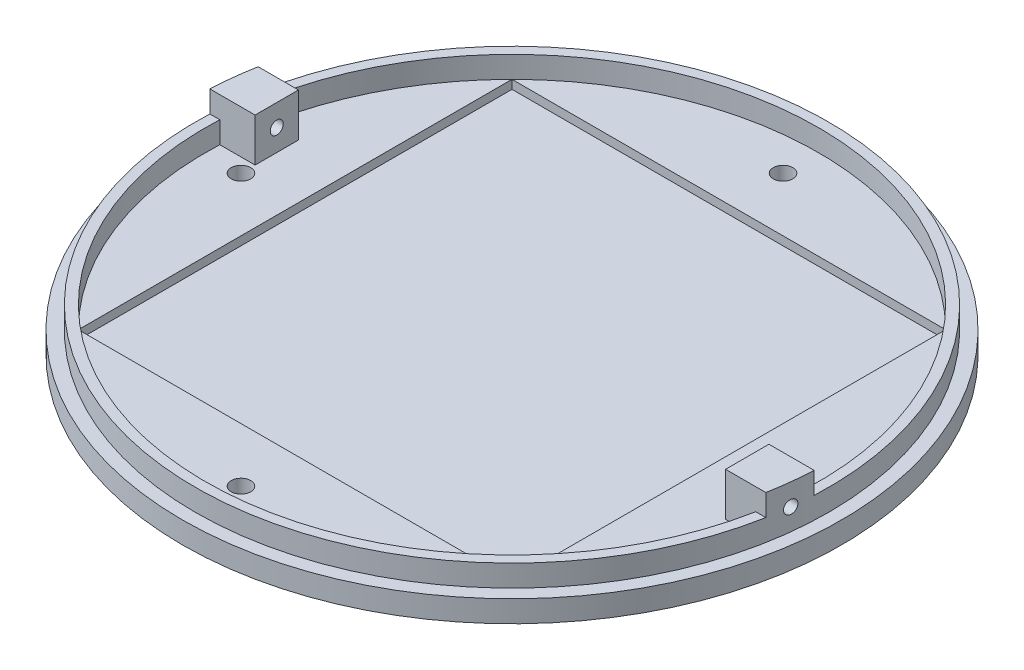
ISO-10303-21;
HEADER;
FILE_DESCRIPTION(('STEP AP214'),'2;1');
FILE_NAME('part.step','',(''),(''),'','','');
FILE_SCHEMA(('AUTOMOTIVE_DESIGN { 1 0 10303 214 1 1 1 1 }'));
ENDSEC;
DATA;
#1=APPLICATION_CONTEXT('core data for automotive mechanical design processes');
#2=APPLICATION_PROTOCOL_DEFINITION('international standard','automotive_design',2000,#1);
#3=PRODUCT_CONTEXT('',#1,'mechanical');
#4=PRODUCT('Part','Part','',(#3));
#5=PRODUCT_RELATED_PRODUCT_CATEGORY('part','',(#4));
#6=PRODUCT_DEFINITION_FORMATION('','',#4);
#7=PRODUCT_DEFINITION_CONTEXT('part definition',#1,'design');
#8=PRODUCT_DEFINITION('design','',#6,#7);
#9=PRODUCT_DEFINITION_SHAPE('','',#8);
#10=(LENGTH_UNIT() NAMED_UNIT(*) SI_UNIT(.MILLI.,.METRE.));
#11=(NAMED_UNIT(*) PLANE_ANGLE_UNIT() SI_UNIT($,.RADIAN.));
#12=(NAMED_UNIT(*) SI_UNIT($,.STERADIAN.) SOLID_ANGLE_UNIT());
#13=UNCERTAINTY_MEASURE_WITH_UNIT(LENGTH_MEASURE(1.E-05),#10,'distance_accuracy_value','');
#14=(GEOMETRIC_REPRESENTATION_CONTEXT(3) GLOBAL_UNCERTAINTY_ASSIGNED_CONTEXT((#13)) GLOBAL_UNIT_ASSIGNED_CONTEXT((#10,
#11,#12)) REPRESENTATION_CONTEXT('',''));
#15=CARTESIAN_POINT('',(0.,0.,0.));
#16=DIRECTION('',(0.,0.,1.));
#17=DIRECTION('',(1.,0.,0.));
#18=AXIS2_PLACEMENT_3D('',#15,#16,#17);
#19=CARTESIAN_POINT('',(0.,10.,0.));
#20=DIRECTION('',(0.,1.,0.));
#21=DIRECTION('',(0.,0.,1.));
#22=AXIS2_PLACEMENT_3D('',#19,#20,#21);
#23=PLANE('',#22);
#24=CARTESIAN_POINT('',(0.,10.,0.));
#25=DIRECTION('',(0.,1.,0.));
#26=DIRECTION('',(0.,0.,1.));
#27=AXIS2_PLACEMENT_3D('',#24,#25,#26);
#28=CIRCLE('',#27,73.);
#29=CARTESIAN_POINT('',(72.9276182251964,10.,3.25));
#30=VERTEX_POINT('',#29);
#31=CARTESIAN_POINT('',(-71.7874466741923,10.,-13.25));
#32=VERTEX_POINT('',#31);
#33=EDGE_CURVE('E289',#30,#32,#28,.T.);
#34=ORIENTED_EDGE('',*,*,#33,.T.);
#35=DIRECTION('',(-1.,0.,0.));
#36=VECTOR('',#35,1.);
#37=CARTESIAN_POINT('',(-69.4581708656368,10.,-13.25));
#38=LINE('',#37,#36);
#39=CARTESIAN_POINT('',(-69.4581708656368,10.,-13.25));
#40=VERTEX_POINT('',#39);
#41=EDGE_CURVE('E194',#40,#32,#38,.T.);
#42=ORIENTED_EDGE('',*,*,#41,.F.);
#43=CARTESIAN_POINT('',(0.,10.,0.));
#44=DIRECTION('',(0.,1.,0.));
#45=DIRECTION('',(0.,0.,1.));
#46=AXIS2_PLACEMENT_3D('',#43,#44,#45);
#47=CIRCLE('',#46,70.7106781186548);
#48=CARTESIAN_POINT('',(70.6359504784922,10.,3.24999999999998));
#49=VERTEX_POINT('',#48);
#50=EDGE_CURVE('E279',#49,#40,#47,.T.);
#51=ORIENTED_EDGE('',*,*,#50,.F.);
#52=DIRECTION('',(1.,0.,0.));
#53=VECTOR('',#52,1.);
#54=CARTESIAN_POINT('',(0.,10.,3.25));
#55=LINE('',#54,#53);
#56=EDGE_CURVE('E239',#49,#30,#55,.T.);
#57=ORIENTED_EDGE('',*,*,#56,.T.);
#58=EDGE_LOOP('',(#34,#42,#51,#57));
#59=FACE_BOUND('',#58,.T.);
#60=ADVANCED_FACE('F58',(#59),#23,.T.);
#61=CARTESIAN_POINT('',(0.,10.,0.));
#62=DIRECTION('',(0.,-1.,0.));
#63=DIRECTION('',(0.,0.,-1.));
#64=AXIS2_PLACEMENT_3D('',#61,#62,#63);
#65=CYLINDRICAL_SURFACE('',#64,70.7106781186548);
#66=ORIENTED_EDGE('',*,*,#50,.T.);
#67=DIRECTION('',(0.,-1.,0.));
#68=VECTOR('',#67,1.);
#69=CARTESIAN_POINT('',(-69.4581708656368,15.,-13.25));
#70=LINE('',#69,#68);
#71=CARTESIAN_POINT('',(-69.4581708656368,5.,-13.25));
#72=VERTEX_POINT('',#71);
#73=EDGE_CURVE('E225',#40,#72,#70,.T.);
#74=ORIENTED_EDGE('',*,*,#73,.T.);
#75=CARTESIAN_POINT('',(0.,5.,0.));
#76=DIRECTION('',(0.,1.,0.));
#77=DIRECTION('',(0.,0.,1.));
#78=AXIS2_PLACEMENT_3D('',#75,#76,#77);
#79=CIRCLE('',#78,70.7106781186548);
#80=CARTESIAN_POINT('',(-50.,5.,-50.));
#81=VERTEX_POINT('',#80);
#82=EDGE_CURVE('E402',#81,#72,#79,.T.);
#83=ORIENTED_EDGE('',*,*,#82,.F.);
#84=CARTESIAN_POINT('',(50.,5.,-50.));
#85=VERTEX_POINT('',#84);
#86=EDGE_CURVE('E298',#85,#81,#79,.T.);
#87=ORIENTED_EDGE('',*,*,#86,.F.);
#88=CARTESIAN_POINT('',(70.6359504784922,5.,3.25));
#89=VERTEX_POINT('',#88);
#90=EDGE_CURVE('E278',#89,#85,#79,.T.);
#91=ORIENTED_EDGE('',*,*,#90,.F.);
#92=DIRECTION('',(0.,-1.,0.));
#93=VECTOR('',#92,1.);
#94=CARTESIAN_POINT('',(70.6359504784922,10.,3.25));
#95=LINE('',#94,#93);
#96=EDGE_CURVE('E67',#49,#89,#95,.T.);
#97=ORIENTED_EDGE('',*,*,#96,.F.);
#98=EDGE_LOOP('',(#66,#74,#83,#87,#91,#97));
#99=FACE_BOUND('',#98,.T.);
#100=ADVANCED_FACE('F393',(#99),#65,.F.);
#101=DIRECTION('',(-1.,0.,0.));
#102=VECTOR('',#101,1.);
#103=CARTESIAN_POINT('',(-70.6359504784922,10.,-3.25));
#104=LINE('',#103,#102);
#105=CARTESIAN_POINT('',(-70.6359504784922,10.,-3.25));
#106=VERTEX_POINT('',#105);
#107=CARTESIAN_POINT('',(-72.9276182251964,10.,-3.25000000000003));
#108=VERTEX_POINT('',#107);
#109=EDGE_CURVE('E398',#106,#108,#104,.T.);
#110=ORIENTED_EDGE('',*,*,#109,.T.);
#111=CARTESIAN_POINT('',(71.7874466741923,10.,13.25));
#112=VERTEX_POINT('',#111);
#113=EDGE_CURVE('E201',#108,#112,#28,.T.);
#114=ORIENTED_EDGE('',*,*,#113,.T.);
#115=DIRECTION('',(1.,0.,0.));
#116=VECTOR('',#115,1.);
#117=CARTESIAN_POINT('',(0.,10.,13.25));
#118=LINE('',#117,#116);
#119=CARTESIAN_POINT('',(69.4581708656368,10.,13.25));
#120=VERTEX_POINT('',#119);
#121=EDGE_CURVE('E233',#120,#112,#118,.T.);
#122=ORIENTED_EDGE('',*,*,#121,.F.);
#123=EDGE_CURVE('E283',#106,#120,#47,.T.);
#124=ORIENTED_EDGE('',*,*,#123,.F.);
#125=EDGE_LOOP('',(#110,#114,#122,#124));
#126=FACE_BOUND('',#125,.T.);
#127=ADVANCED_FACE('F455',(#126),#23,.T.);
#128=CARTESIAN_POINT('',(0.,5.,0.));
#129=DIRECTION('',(0.,1.,0.));
#130=DIRECTION('',(0.,0.,1.));
#131=AXIS2_PLACEMENT_3D('',#128,#129,#130);
#132=PLANE('',#131);
#133=CARTESIAN_POINT('',(62.5,5.,0.));
#134=DIRECTION('',(0.,1.,0.));
#135=DIRECTION('',(0.,0.,1.));
#136=AXIS2_PLACEMENT_3D('',#133,#134,#135);
#137=CIRCLE('',#136,2.25);
#138=CARTESIAN_POINT('',(62.5,5.,2.25));
#139=VERTEX_POINT('',#138);
#140=EDGE_CURVE('E304',#139,#139,#137,.T.);
#141=ORIENTED_EDGE('',*,*,#140,.F.);
#142=EDGE_LOOP('',(#141));
#143=FACE_BOUND('',#142,.T.);
#144=CARTESIAN_POINT('',(50.,5.,50.));
#145=VERTEX_POINT('',#144);
#146=CARTESIAN_POINT('',(69.4581708656368,5.,13.25));
#147=VERTEX_POINT('',#146);
#148=EDGE_CURVE('E284',#145,#147,#79,.T.);
#149=ORIENTED_EDGE('',*,*,#148,.T.);
#150=DIRECTION('',(1.,0.,0.));
#151=VECTOR('',#150,1.);
#152=CARTESIAN_POINT('',(0.,5.,13.25));
#153=LINE('',#152,#151);
#154=CARTESIAN_POINT('',(62.5,5.,13.25));
#155=VERTEX_POINT('',#154);
#156=EDGE_CURVE('E82',#155,#147,#153,.T.);
#157=ORIENTED_EDGE('',*,*,#156,.F.);
#158=DIRECTION('',(0.,0.,1.));
#159=VECTOR('',#158,1.);
#160=CARTESIAN_POINT('',(62.5,5.,0.));
#161=LINE('',#160,#159);
#162=CARTESIAN_POINT('',(62.5,5.,3.25));
#163=VERTEX_POINT('',#162);
#164=EDGE_CURVE('E251',#163,#155,#161,.T.);
#165=ORIENTED_EDGE('',*,*,#164,.F.);
#166=DIRECTION('',(1.,0.,0.));
#167=VECTOR('',#166,1.);
#168=CARTESIAN_POINT('',(0.,5.,3.25));
#169=LINE('',#168,#167);
#170=EDGE_CURVE('E257',#163,#89,#169,.T.);
#171=ORIENTED_EDGE('',*,*,#170,.T.);
#172=ORIENTED_EDGE('',*,*,#90,.T.);
#173=DIRECTION('',(0.,0.,-1.));
#174=VECTOR('',#173,1.);
#175=CARTESIAN_POINT('',(50.,5.,50.));
#176=LINE('',#175,#174);
#177=EDGE_CURVE('E333',#145,#85,#176,.T.);
#178=ORIENTED_EDGE('',*,*,#177,.F.);
#179=EDGE_LOOP('',(#149,#157,#165,#171,#172,#178));
#180=FACE_BOUND('',#179,.T.);
#181=ADVANCED_FACE('F427',(#143,#180),#132,.T.);
#182=DIRECTION('',(0.,-1.,0.));
#183=VECTOR('',#182,1.);
#184=CARTESIAN_POINT('',(-70.6359504784922,15.,-3.25));
#185=LINE('',#184,#183);
#186=CARTESIAN_POINT('',(-70.6359504784922,5.,-3.25));
#187=VERTEX_POINT('',#186);
#188=EDGE_CURVE('E214',#106,#187,#185,.T.);
#189=ORIENTED_EDGE('',*,*,#188,.F.);
#190=ORIENTED_EDGE('',*,*,#123,.T.);
#191=DIRECTION('',(0.,-1.,0.));
#192=VECTOR('',#191,1.);
#193=CARTESIAN_POINT('',(69.4581708656368,10.,13.25));
#194=LINE('',#193,#192);
#195=EDGE_CURVE('E12',#120,#147,#194,.T.);
#196=ORIENTED_EDGE('',*,*,#195,.T.);
#197=ORIENTED_EDGE('',*,*,#148,.F.);
#198=CARTESIAN_POINT('',(-50.,5.,50.));
#199=VERTEX_POINT('',#198);
#200=EDGE_CURVE('E288',#199,#145,#79,.T.);
#201=ORIENTED_EDGE('',*,*,#200,.F.);
#202=EDGE_CURVE('E287',#187,#199,#79,.T.);
#203=ORIENTED_EDGE('',*,*,#202,.F.);
#204=EDGE_LOOP('',(#189,#190,#196,#197,#201,#203));
#205=FACE_BOUND('',#204,.T.);
#206=ADVANCED_FACE('F461',(#205),#65,.F.);
#207=CARTESIAN_POINT('',(0.,5.,-62.5));
#208=DIRECTION('',(0.,1.,0.));
#209=DIRECTION('',(0.,0.,1.));
#210=AXIS2_PLACEMENT_3D('',#207,#208,#209);
#211=CIRCLE('',#210,2.25);
#212=CARTESIAN_POINT('',(0.,5.,-60.25));
#213=VERTEX_POINT('',#212);
#214=EDGE_CURVE('E299',#213,#213,#211,.T.);
#215=ORIENTED_EDGE('',*,*,#214,.F.);
#216=EDGE_LOOP('',(#215));
#217=FACE_BOUND('',#216,.T.);
#218=DIRECTION('',(-1.,0.,0.));
#219=VECTOR('',#218,1.);
#220=CARTESIAN_POINT('',(-50.,5.,-50.));
#221=LINE('',#220,#219);
#222=EDGE_CURVE('E337',#85,#81,#221,.T.);
#223=ORIENTED_EDGE('',*,*,#222,.F.);
#224=ORIENTED_EDGE('',*,*,#86,.T.);
#225=EDGE_LOOP('',(#223,#224));
#226=FACE_BOUND('',#225,.T.);
#227=ADVANCED_FACE('F431',(#217,#226),#132,.T.);
#228=DIRECTION('',(-1.,0.,0.));
#229=VECTOR('',#228,1.);
#230=CARTESIAN_POINT('',(0.,5.,-3.25));
#231=LINE('',#230,#229);
#232=CARTESIAN_POINT('',(-62.5,5.,-3.25));
#233=VERTEX_POINT('',#232);
#234=EDGE_CURVE('E206',#233,#187,#231,.T.);
#235=ORIENTED_EDGE('',*,*,#234,.T.);
#236=ORIENTED_EDGE('',*,*,#202,.T.);
#237=DIRECTION('',(0.,0.,1.));
#238=VECTOR('',#237,1.);
#239=CARTESIAN_POINT('',(-50.,5.,50.));
#240=LINE('',#239,#238);
#241=EDGE_CURVE('E342',#81,#199,#240,.T.);
#242=ORIENTED_EDGE('',*,*,#241,.F.);
#243=ORIENTED_EDGE('',*,*,#82,.T.);
#244=DIRECTION('',(-1.,0.,0.));
#245=VECTOR('',#244,1.);
#246=CARTESIAN_POINT('',(0.,5.,-13.25));
#247=LINE('',#246,#245);
#248=CARTESIAN_POINT('',(-62.5,5.,-13.25));
#249=VERTEX_POINT('',#248);
#250=EDGE_CURVE('E184',#249,#72,#247,.T.);
#251=ORIENTED_EDGE('',*,*,#250,.F.);
#252=DIRECTION('',(0.,0.,-1.));
#253=VECTOR('',#252,1.);
#254=CARTESIAN_POINT('',(-62.5,5.,0.));
#255=LINE('',#254,#253);
#256=EDGE_CURVE('E218',#233,#249,#255,.T.);
#257=ORIENTED_EDGE('',*,*,#256,.F.);
#258=EDGE_LOOP('',(#235,#236,#242,#243,#251,#257));
#259=FACE_BOUND('',#258,.T.);
#260=CARTESIAN_POINT('',(-62.5,5.,0.));
#261=DIRECTION('',(0.,1.,0.));
#262=DIRECTION('',(0.,0.,1.));
#263=AXIS2_PLACEMENT_3D('',#260,#261,#262);
#264=CIRCLE('',#263,2.25);
#265=CARTESIAN_POINT('',(-62.5,5.,2.25));
#266=VERTEX_POINT('',#265);
#267=EDGE_CURVE('E293',#266,#266,#264,.T.);
#268=ORIENTED_EDGE('',*,*,#267,.F.);
#269=EDGE_LOOP('',(#268));
#270=FACE_BOUND('',#269,.T.);
#271=ADVANCED_FACE('F406',(#259,#270),#132,.T.);
#272=CARTESIAN_POINT('',(0.,5.,62.5));
#273=DIRECTION('',(0.,1.,0.));
#274=DIRECTION('',(0.,0.,1.));
#275=AXIS2_PLACEMENT_3D('',#272,#273,#274);
#276=CIRCLE('',#275,2.25);
#277=CARTESIAN_POINT('',(0.,5.,64.75));
#278=VERTEX_POINT('',#277);
#279=EDGE_CURVE('E308',#278,#278,#276,.T.);
#280=ORIENTED_EDGE('',*,*,#279,.F.);
#281=EDGE_LOOP('',(#280));
#282=FACE_BOUND('',#281,.T.);
#283=DIRECTION('',(1.,0.,0.));
#284=VECTOR('',#283,1.);
#285=CARTESIAN_POINT('',(-50.,5.,50.));
#286=LINE('',#285,#284);
#287=EDGE_CURVE('E320',#199,#145,#286,.T.);
#288=ORIENTED_EDGE('',*,*,#287,.F.);
#289=ORIENTED_EDGE('',*,*,#200,.T.);
#290=EDGE_LOOP('',(#288,#289));
#291=FACE_BOUND('',#290,.T.);
#292=ADVANCED_FACE('F417',(#282,#291),#132,.T.);
#293=CARTESIAN_POINT('',(0.,5.,0.));
#294=DIRECTION('',(0.,-1.,0.));
#295=DIRECTION('',(0.,0.,-1.));
#296=AXIS2_PLACEMENT_3D('',#293,#294,#295);
#297=CYLINDRICAL_SURFACE('',#296,76.);
#298=CARTESIAN_POINT('',(0.,5.,0.));
#299=DIRECTION('',(0.,1.,0.));
#300=DIRECTION('',(0.,0.,1.));
#301=AXIS2_PLACEMENT_3D('',#298,#299,#300);
#302=CIRCLE('',#301,76.);
#303=CARTESIAN_POINT('',(0.,5.,76.));
#304=VERTEX_POINT('',#303);
#305=EDGE_CURVE('E365',#304,#304,#302,.T.);
#306=ORIENTED_EDGE('',*,*,#305,.F.);
#307=EDGE_LOOP('',(#306));
#308=FACE_BOUND('',#307,.T.);
#309=CARTESIAN_POINT('',(0.,0.,0.));
#310=DIRECTION('',(0.,1.,0.));
#311=DIRECTION('',(0.,0.,1.));
#312=AXIS2_PLACEMENT_3D('',#309,#310,#311);
#313=CIRCLE('',#312,76.);
#314=CARTESIAN_POINT('',(0.,0.,76.));
#315=VERTEX_POINT('',#314);
#316=EDGE_CURVE('E353',#315,#315,#313,.T.);
#317=ORIENTED_EDGE('',*,*,#316,.T.);
#318=EDGE_LOOP('',(#317));
#319=FACE_BOUND('',#318,.T.);
#320=ADVANCED_FACE('F60',(#308,#319),#297,.T.);
#321=CARTESIAN_POINT('',(0.,5.,0.));
#322=DIRECTION('',(0.,1.,0.));
#323=DIRECTION('',(0.,0.,1.));
#324=AXIS2_PLACEMENT_3D('',#321,#322,#323);
#325=CIRCLE('',#324,73.);
#326=CARTESIAN_POINT('',(0.,5.,73.));
#327=VERTEX_POINT('',#326);
#328=EDGE_CURVE('E294',#327,#327,#325,.T.);
#329=ORIENTED_EDGE('',*,*,#328,.F.);
#330=EDGE_LOOP('',(#329));
#331=FACE_BOUND('',#330,.T.);
#332=ORIENTED_EDGE('',*,*,#305,.T.);
#333=EDGE_LOOP('',(#332));
#334=FACE_BOUND('',#333,.T.);
#335=ADVANCED_FACE('F471',(#331,#334),#132,.T.);
#336=CARTESIAN_POINT('',(0.,0.,0.));
#337=DIRECTION('',(0.,1.,0.));
#338=DIRECTION('',(0.,0.,1.));
#339=AXIS2_PLACEMENT_3D('',#336,#337,#338);
#340=PLANE('',#339);
#341=CARTESIAN_POINT('',(0.,0.,-62.5));
#342=DIRECTION('',(0.,1.,0.));
#343=DIRECTION('',(0.,0.,1.));
#344=AXIS2_PLACEMENT_3D('',#341,#342,#343);
#345=CIRCLE('',#344,2.25);
#346=CARTESIAN_POINT('',(0.,0.,-60.25));
#347=VERTEX_POINT('',#346);
#348=EDGE_CURVE('E338',#347,#347,#345,.T.);
#349=ORIENTED_EDGE('',*,*,#348,.T.);
#350=EDGE_LOOP('',(#349));
#351=FACE_BOUND('',#350,.T.);
#352=CARTESIAN_POINT('',(62.5,0.,0.));
#353=DIRECTION('',(0.,1.,0.));
#354=DIRECTION('',(0.,0.,1.));
#355=AXIS2_PLACEMENT_3D('',#352,#353,#354);
#356=CIRCLE('',#355,2.25);
#357=CARTESIAN_POINT('',(62.5,0.,2.25));
#358=VERTEX_POINT('',#357);
#359=EDGE_CURVE('E379',#358,#358,#356,.T.);
#360=ORIENTED_EDGE('',*,*,#359,.T.);
#361=EDGE_LOOP('',(#360));
#362=FACE_BOUND('',#361,.T.);
#363=CARTESIAN_POINT('',(0.,0.,62.5));
#364=DIRECTION('',(0.,1.,0.));
#365=DIRECTION('',(0.,0.,1.));
#366=AXIS2_PLACEMENT_3D('',#363,#364,#365);
#367=CIRCLE('',#366,2.25);
#368=CARTESIAN_POINT('',(0.,0.,64.75));
#369=VERTEX_POINT('',#368);
#370=EDGE_CURVE('E375',#369,#369,#367,.T.);
#371=ORIENTED_EDGE('',*,*,#370,.T.);
#372=EDGE_LOOP('',(#371));
#373=FACE_BOUND('',#372,.T.);
#374=CARTESIAN_POINT('',(-62.5,0.,0.));
#375=DIRECTION('',(0.,1.,0.));
#376=DIRECTION('',(0.,0.,1.));
#377=AXIS2_PLACEMENT_3D('',#374,#375,#376);
#378=CIRCLE('',#377,2.25);
#379=CARTESIAN_POINT('',(-62.5,0.,2.25));
#380=VERTEX_POINT('',#379);
#381=EDGE_CURVE('E303',#380,#380,#378,.T.);
#382=ORIENTED_EDGE('',*,*,#381,.T.);
#383=EDGE_LOOP('',(#382));
#384=FACE_BOUND('',#383,.T.);
#385=ORIENTED_EDGE('',*,*,#316,.F.);
#386=EDGE_LOOP('',(#385));
#387=FACE_BOUND('',#386,.T.);
#388=ADVANCED_FACE('F545',(#351,#362,#373,#384,#387),#340,.F.);
#389=CARTESIAN_POINT('',(50.,3.,50.));
#390=DIRECTION('',(1.,0.,0.));
#391=DIRECTION('',(0.,0.,-1.));
#392=AXIS2_PLACEMENT_3D('',#389,#390,#391);
#393=PLANE('',#392);
#394=ORIENTED_EDGE('',*,*,#177,.T.);
#395=DIRECTION('',(0.,1.,0.));
#396=VECTOR('',#395,1.);
#397=CARTESIAN_POINT('',(50.,3.,-50.));
#398=LINE('',#397,#396);
#399=CARTESIAN_POINT('',(50.,3.,-50.));
#400=VERTEX_POINT('',#399);
#401=EDGE_CURVE('E332',#400,#85,#398,.T.);
#402=ORIENTED_EDGE('',*,*,#401,.F.);
#403=DIRECTION('',(0.,0.,-1.));
#404=VECTOR('',#403,1.);
#405=CARTESIAN_POINT('',(50.,3.,50.));
#406=LINE('',#405,#404);
#407=CARTESIAN_POINT('',(50.,3.,50.));
#408=VERTEX_POINT('',#407);
#409=EDGE_CURVE('E315',#408,#400,#406,.T.);
#410=ORIENTED_EDGE('',*,*,#409,.F.);
#411=DIRECTION('',(0.,1.,0.));
#412=VECTOR('',#411,1.);
#413=CARTESIAN_POINT('',(50.,3.,50.));
#414=LINE('',#413,#412);
#415=EDGE_CURVE('E349',#408,#145,#414,.T.);
#416=ORIENTED_EDGE('',*,*,#415,.T.);
#417=EDGE_LOOP('',(#394,#402,#410,#416));
#418=FACE_BOUND('',#417,.T.);
#419=ADVANCED_FACE('F422',(#418),#393,.F.);
#420=CARTESIAN_POINT('',(-50.,3.,50.));
#421=DIRECTION('',(0.,0.,1.));
#422=DIRECTION('',(1.,0.,0.));
#423=AXIS2_PLACEMENT_3D('',#420,#421,#422);
#424=PLANE('',#423);
#425=ORIENTED_EDGE('',*,*,#287,.T.);
#426=ORIENTED_EDGE('',*,*,#415,.F.);
#427=DIRECTION('',(1.,0.,0.));
#428=VECTOR('',#427,1.);
#429=CARTESIAN_POINT('',(-50.,3.,50.));
#430=LINE('',#429,#428);
#431=CARTESIAN_POINT('',(-50.,3.,50.));
#432=VERTEX_POINT('',#431);
#433=EDGE_CURVE('E328',#432,#408,#430,.T.);
#434=ORIENTED_EDGE('',*,*,#433,.F.);
#435=DIRECTION('',(0.,1.,0.));
#436=VECTOR('',#435,1.);
#437=CARTESIAN_POINT('',(-50.,3.,50.));
#438=LINE('',#437,#436);
#439=EDGE_CURVE('E354',#432,#199,#438,.T.);
#440=ORIENTED_EDGE('',*,*,#439,.T.);
#441=EDGE_LOOP('',(#425,#426,#434,#440));
#442=FACE_BOUND('',#441,.T.);
#443=ADVANCED_FACE('F426',(#442),#424,.F.);
#444=CARTESIAN_POINT('',(-50.,3.,50.));
#445=DIRECTION('',(-1.,0.,0.));
#446=DIRECTION('',(0.,0.,1.));
#447=AXIS2_PLACEMENT_3D('',#444,#445,#446);
#448=PLANE('',#447);
#449=ORIENTED_EDGE('',*,*,#241,.T.);
#450=ORIENTED_EDGE('',*,*,#439,.F.);
#451=DIRECTION('',(0.,0.,1.));
#452=VECTOR('',#451,1.);
#453=CARTESIAN_POINT('',(-50.,3.,50.));
#454=LINE('',#453,#452);
#455=CARTESIAN_POINT('',(-50.,3.,-50.));
#456=VERTEX_POINT('',#455);
#457=EDGE_CURVE('E324',#456,#432,#454,.T.);
#458=ORIENTED_EDGE('',*,*,#457,.F.);
#459=DIRECTION('',(0.,1.,0.));
#460=VECTOR('',#459,1.);
#461=CARTESIAN_POINT('',(-50.,3.,-50.));
#462=LINE('',#461,#460);
#463=EDGE_CURVE('E358',#456,#81,#462,.T.);
#464=ORIENTED_EDGE('',*,*,#463,.T.);
#465=EDGE_LOOP('',(#449,#450,#458,#464));
#466=FACE_BOUND('',#465,.T.);
#467=ADVANCED_FACE('F434',(#466),#448,.F.);
#468=CARTESIAN_POINT('',(-50.,3.,-50.));
#469=DIRECTION('',(0.,0.,-1.));
#470=DIRECTION('',(-1.,0.,0.));
#471=AXIS2_PLACEMENT_3D('',#468,#469,#470);
#472=PLANE('',#471);
#473=ORIENTED_EDGE('',*,*,#222,.T.);
#474=ORIENTED_EDGE('',*,*,#463,.F.);
#475=DIRECTION('',(-1.,0.,0.));
#476=VECTOR('',#475,1.);
#477=CARTESIAN_POINT('',(-50.,3.,-50.));
#478=LINE('',#477,#476);
#479=EDGE_CURVE('E319',#400,#456,#478,.T.);
#480=ORIENTED_EDGE('',*,*,#479,.F.);
#481=ORIENTED_EDGE('',*,*,#401,.T.);
#482=EDGE_LOOP('',(#473,#474,#480,#481));
#483=FACE_BOUND('',#482,.T.);
#484=ADVANCED_FACE('F437',(#483),#472,.F.);
#485=CARTESIAN_POINT('',(0.,3.,0.));
#486=DIRECTION('',(0.,-1.,0.));
#487=DIRECTION('',(0.,0.,-1.));
#488=AXIS2_PLACEMENT_3D('',#485,#486,#487);
#489=PLANE('',#488);
#490=ORIENTED_EDGE('',*,*,#409,.T.);
#491=ORIENTED_EDGE('',*,*,#479,.T.);
#492=ORIENTED_EDGE('',*,*,#457,.T.);
#493=ORIENTED_EDGE('',*,*,#433,.T.);
#494=EDGE_LOOP('',(#490,#491,#492,#493));
#495=FACE_BOUND('',#494,.T.);
#496=ADVANCED_FACE('F439',(#495),#489,.F.);
#497=CARTESIAN_POINT('',(-62.5,-5.,0.));
#498=DIRECTION('',(0.,1.,0.));
#499=DIRECTION('',(0.,0.,1.));
#500=AXIS2_PLACEMENT_3D('',#497,#498,#499);
#501=CYLINDRICAL_SURFACE('',#500,2.25);
#502=ORIENTED_EDGE('',*,*,#267,.T.);
#503=EDGE_LOOP('',(#502));
#504=FACE_BOUND('',#503,.T.);
#505=ORIENTED_EDGE('',*,*,#381,.F.);
#506=EDGE_LOOP('',(#505));
#507=FACE_BOUND('',#506,.T.);
#508=ADVANCED_FACE('F441',(#504,#507),#501,.F.);
#509=CARTESIAN_POINT('',(0.,-5.,62.5));
#510=DIRECTION('',(0.,1.,0.));
#511=DIRECTION('',(0.,0.,1.));
#512=AXIS2_PLACEMENT_3D('',#509,#510,#511);
#513=CYLINDRICAL_SURFACE('',#512,2.25);
#514=ORIENTED_EDGE('',*,*,#279,.T.);
#515=EDGE_LOOP('',(#514));
#516=FACE_BOUND('',#515,.T.);
#517=ORIENTED_EDGE('',*,*,#370,.F.);
#518=EDGE_LOOP('',(#517));
#519=FACE_BOUND('',#518,.T.);
#520=ADVANCED_FACE('F447',(#516,#519),#513,.F.);
#521=CARTESIAN_POINT('',(62.5,-5.,0.));
#522=DIRECTION('',(0.,1.,0.));
#523=DIRECTION('',(0.,0.,1.));
#524=AXIS2_PLACEMENT_3D('',#521,#522,#523);
#525=CYLINDRICAL_SURFACE('',#524,2.25);
#526=ORIENTED_EDGE('',*,*,#140,.T.);
#527=EDGE_LOOP('',(#526));
#528=FACE_BOUND('',#527,.T.);
#529=ORIENTED_EDGE('',*,*,#359,.F.);
#530=EDGE_LOOP('',(#529));
#531=FACE_BOUND('',#530,.T.);
#532=ADVANCED_FACE('F577',(#528,#531),#525,.F.);
#533=CARTESIAN_POINT('',(0.,-5.,-62.5));
#534=DIRECTION('',(0.,1.,0.));
#535=DIRECTION('',(0.,0.,1.));
#536=AXIS2_PLACEMENT_3D('',#533,#534,#535);
#537=CYLINDRICAL_SURFACE('',#536,2.25);
#538=ORIENTED_EDGE('',*,*,#214,.T.);
#539=EDGE_LOOP('',(#538));
#540=FACE_BOUND('',#539,.T.);
#541=ORIENTED_EDGE('',*,*,#348,.F.);
#542=EDGE_LOOP('',(#541));
#543=FACE_BOUND('',#542,.T.);
#544=ADVANCED_FACE('F582',(#540,#543),#537,.F.);
#545=CARTESIAN_POINT('',(0.,10.,0.));
#546=DIRECTION('',(0.,-1.,0.));
#547=DIRECTION('',(0.,0.,-1.));
#548=AXIS2_PLACEMENT_3D('',#545,#546,#547);
#549=CYLINDRICAL_SURFACE('',#548,73.);
#550=CARTESIAN_POINT('',(72.3459570397683,10.,9.74999999999999));
#551=CARTESIAN_POINT('',(72.3459576839866,10.0837194979535,9.74999619649252));
#552=CARTESIAN_POINT('',(72.3469060225839,10.1674998210345,9.74296645850559));
#553=CARTESIAN_POINT('',(72.3506622768941,10.3327415808552,9.71503262343754));
#554=CARTESIAN_POINT('',(72.3534724285061,10.4142001064551,9.6941118441804));
#555=CARTESIAN_POINT('',(72.360831309766,10.5723692137992,9.63902793065619));
#556=CARTESIAN_POINT('',(72.3653788455566,10.6490830139533,9.60487388950066));
#557=CARTESIAN_POINT('',(72.3760226823596,10.795650042771,9.52433633306369));
#558=CARTESIAN_POINT('',(72.3821186333547,10.8655048169664,9.47795558152392));
#559=CARTESIAN_POINT('',(72.3956458310517,10.9967437673068,9.3740712768735));
#560=CARTESIAN_POINT('',(72.4030828521277,11.0580891992615,9.31651953848937));
#561=CARTESIAN_POINT('',(72.418987844179,11.1702674187536,9.1920687177523));
#562=CARTESIAN_POINT('',(72.4274558965542,11.2210993753973,9.12516889730761));
#563=CARTESIAN_POINT('',(72.4451860402608,11.3112398337935,8.98332685614013));
#564=CARTESIAN_POINT('',(72.4544540446053,11.3504509664607,8.90832349043258));
#565=CARTESIAN_POINT('',(72.4734009658881,11.4157178163274,8.7528441396596));
#566=CARTESIAN_POINT('',(72.4830798973321,11.4417730687106,8.67236796134566));
#567=CARTESIAN_POINT('',(72.5025917086718,11.4801263433152,8.50770855597137));
#568=CARTESIAN_POINT('',(72.5124251606248,11.4923420474444,8.42350621099542));
#569=CARTESIAN_POINT('',(72.5318898772766,11.5023886710994,8.25422370605417));
#570=CARTESIAN_POINT('',(72.5415211400423,11.5002194531517,8.16914353770749));
#571=CARTESIAN_POINT('',(72.5603223089031,11.481527805145,8.00042750574202));
#572=CARTESIAN_POINT('',(72.569491710082,11.4649900125534,7.91679328573999));
#573=CARTESIAN_POINT('',(72.5871244974414,11.4179801312537,7.75345786676126));
#574=CARTESIAN_POINT('',(72.5955878923884,11.3875082155964,7.67375661895376));
#575=CARTESIAN_POINT('',(72.6115890675079,11.3135881327531,7.52083976771873));
#576=CARTESIAN_POINT('',(72.6191297767575,11.2701826149739,7.44760385771623));
#577=CARTESIAN_POINT('',(72.6331656652517,11.1715672330749,7.30945102565393));
#578=CARTESIAN_POINT('',(72.6396608726004,11.1163576863518,7.24453387998723));
#579=CARTESIAN_POINT('',(72.6514604065485,10.9960080138712,7.12522872939867));
#580=CARTESIAN_POINT('',(72.6567707394472,10.9309209204066,7.07078782173024));
#581=CARTESIAN_POINT('',(72.6661625627431,10.792450353963,6.97360808747956));
#582=CARTESIAN_POINT('',(72.6702440853808,10.7190670987218,6.93086895387793));
#583=CARTESIAN_POINT('',(72.6771079232213,10.5664643580198,6.85852059218761));
#584=CARTESIAN_POINT('',(72.679896326038,10.487274294261,6.82884987586415));
#585=CARTESIAN_POINT('',(72.6841701957475,10.3250062973274,6.78320963989066));
#586=CARTESIAN_POINT('',(72.6856556870726,10.2419284370877,6.76723986331955));
#587=CARTESIAN_POINT('',(72.6873055541146,10.0745100096234,6.74949568781788));
#588=CARTESIAN_POINT('',(72.6874738735133,9.99017396977269,6.74767891412988));
#589=CARTESIAN_POINT('',(72.6864980895324,9.82239498800952,6.75818187661222));
#590=CARTESIAN_POINT('',(72.6853539971177,9.73895203864138,6.77050149467617));
#591=CARTESIAN_POINT('',(72.6817667191842,9.57539544960857,6.8089025665746));
#592=CARTESIAN_POINT('',(72.6793245684793,9.49527921265724,6.83497305806577));
#593=CARTESIAN_POINT('',(72.6731691873526,9.3405709498637,6.90011190600671));
#594=CARTESIAN_POINT('',(72.6694559534995,9.26597893893488,6.9391802975445));
#595=CARTESIAN_POINT('',(72.6607987512784,9.12431334692029,7.02925080354293));
#596=CARTESIAN_POINT('',(72.6558529965121,9.0572508855143,7.08027023316641));
#597=CARTESIAN_POINT('',(72.6448048497182,8.93264516690478,7.19274029224449));
#598=CARTESIAN_POINT('',(72.6387024400345,8.87510205503659,7.2541910809294));
#599=CARTESIAN_POINT('',(72.6254183461671,8.77094104777774,7.38600059155131));
#600=CARTESIAN_POINT('',(72.6182328849917,8.72436290801446,7.45639034598731));
#601=CARTESIAN_POINT('',(72.6029358217602,8.64367616052311,7.60389382952391));
#602=CARTESIAN_POINT('',(72.5948241967901,8.60956786139567,7.68100772497347));
#603=CARTESIAN_POINT('',(72.5778066462391,8.55460319206205,7.84017954334163));
#604=CARTESIAN_POINT('',(72.5688969187923,8.53381456650864,7.9222604524693));
#605=CARTESIAN_POINT('',(72.5505349489889,8.50631561916956,8.08868875026513));
#606=CARTESIAN_POINT('',(72.5410826891706,8.49960575077798,8.17303621183704));
#607=CARTESIAN_POINT('',(72.5218420394653,8.50043212259066,8.34204384676314));
#608=CARTESIAN_POINT('',(72.5120522257668,8.50803854877835,8.42670351934112));
#609=CARTESIAN_POINT('',(72.4924705950913,8.53741297386514,8.59353036552764));
#610=CARTESIAN_POINT('',(72.4826787780746,8.55918128925436,8.67569748338957));
#611=CARTESIAN_POINT('',(72.4633847574947,8.6163409926706,8.83540372699321));
#612=CARTESIAN_POINT('',(72.4538832758826,8.65176376185446,8.91293171324563));
#613=CARTESIAN_POINT('',(72.4355229563919,8.73524741409821,9.0609371430116));
#614=CARTESIAN_POINT('',(72.4266640903374,8.78330774263024,9.13141489569752));
#615=CARTESIAN_POINT('',(72.4099372422607,8.8905930471575,9.26312001027837));
#616=CARTESIAN_POINT('',(72.4020667801118,8.94978910833225,9.3243706055898));
#617=CARTESIAN_POINT('',(72.3875950169084,9.07779009139455,9.43606213753481));
#618=CARTESIAN_POINT('',(72.3809939877467,9.14659706635619,9.48650075867436));
#619=CARTESIAN_POINT('',(72.3693715389729,9.29137183804634,9.57476047651972));
#620=CARTESIAN_POINT('',(72.3643401473623,9.36729027168046,9.61266132341479));
#621=CARTESIAN_POINT('',(72.3560154592561,9.52444463674994,9.67512427096312));
#622=CARTESIAN_POINT('',(72.3527199655661,9.60567369912919,9.69970323479644));
#623=CARTESIAN_POINT('',(72.3489002073855,9.73953686876972,9.72814215409445));
#624=CARTESIAN_POINT('',(72.3477984906373,9.79127550208069,9.73632807662234));
#625=CARTESIAN_POINT('',(72.3463267073319,9.89533483301218,9.74725817450741));
#626=CARTESIAN_POINT('',(72.3459566369796,9.9476555276121,9.75000237809109));
#627=CARTESIAN_POINT('',(72.3459570397683,10.,9.74999999999999));
#628=B_SPLINE_CURVE_WITH_KNOTS('',3,(#550,#551,#552,#553,#554,#555,#556,#557,#558,#559,#560,
#561,#562,#563,#564,#565,#566,#567,#568,#569,#570,#571,#572,#573,#574,#575,#576,#577,#578,#579,
#580,#581,#582,#583,#584,#585,#586,#587,#588,#589,#590,#591,#592,#593,#594,#595,#596,#597,#598,
#599,#600,#601,#602,#603,#604,#605,#606,#607,#608,#609,#610,#611,#612,#613,#614,#615,#616,#617,
#618,#619,#620,#621,#622,#623,#624,#625,#626,#627),.UNSPECIFIED.,.T.,.F.,(4,2,2,2,2,2,2,2,2,2,2,
2,2,2,2,2,2,2,2,2,2,2,2,2,2,2,2,2,2,2,2,2,2,2,2,2,2,2,4),(0.,0.250966477528476,
0.502234894814077,0.7533309606953,1.00437031708807,1.25651759440636,1.50868479164997,
1.76290871413129,2.01714161808744,2.27287889665005,2.52861861923872,2.78463210950381,
3.04064242037024,3.2958176910199,3.55098610116474,3.80483005467461,4.0586673474439,
4.31129720763077,4.56392233037961,4.8157907898097,5.06765714495054,5.31932301235065,
5.57098955913211,5.82302301114652,6.07506031069157,6.32799781078886,6.58094157009937,
6.83516181291689,7.08939024254992,7.3448682807262,7.60035202852591,7.85642647311536,
8.11248968319985,8.36789695957668,8.6233588794879,8.87716313052624,9.1306453548524,
9.28755953035212,9.44447289192738),.UNSPECIFIED.);
#629=CARTESIAN_POINT('',(72.3459570397683,10.,9.74999999999999));
#630=VERTEX_POINT('',#629);
#631=EDGE_CURVE('E596',#630,#630,#628,.T.);
#632=ORIENTED_EDGE('',*,*,#631,.T.);
#633=EDGE_LOOP('',(#632));
#634=FACE_BOUND('',#633,.T.);
#635=CARTESIAN_POINT('',(-72.3459570397683,10.,-9.75));
#636=CARTESIAN_POINT('',(-72.3459576839866,10.0837194979535,-9.74999619649252));
#637=CARTESIAN_POINT('',(-72.3469060225839,10.1674998210345,-9.7429664585056));
#638=CARTESIAN_POINT('',(-72.3506622768941,10.3327415808552,-9.71503262343754));
#639=CARTESIAN_POINT('',(-72.3534724285061,10.4142001064551,-9.69411184418041));
#640=CARTESIAN_POINT('',(-72.360831309766,10.5723692137992,-9.6390279306562));
#641=CARTESIAN_POINT('',(-72.3653788455566,10.6490830139533,-9.60487388950067));
#642=CARTESIAN_POINT('',(-72.3760226823596,10.795650042771,-9.5243363330637));
#643=CARTESIAN_POINT('',(-72.3821186333547,10.8655048169664,-9.47795558152393));
#644=CARTESIAN_POINT('',(-72.3956458310517,10.9967437673068,-9.37407127687351));
#645=CARTESIAN_POINT('',(-72.4030828521277,11.0580891992615,-9.31651953848938));
#646=CARTESIAN_POINT('',(-72.418987844179,11.1702674187536,-9.19206871775231));
#647=CARTESIAN_POINT('',(-72.4274558965542,11.2210993753973,-9.12516889730762));
#648=CARTESIAN_POINT('',(-72.4451860402608,11.3112398337935,-8.98332685614013));
#649=CARTESIAN_POINT('',(-72.4544540446053,11.3504509664607,-8.90832349043259));
#650=CARTESIAN_POINT('',(-72.4734009658881,11.4157178163274,-8.75284413965961));
#651=CARTESIAN_POINT('',(-72.4830798973321,11.4417730687106,-8.67236796134567));
#652=CARTESIAN_POINT('',(-72.5025917086718,11.4801263433152,-8.50770855597138));
#653=CARTESIAN_POINT('',(-72.5124251606248,11.4923420474444,-8.42350621099542));
#654=CARTESIAN_POINT('',(-72.5318898772766,11.5023886710994,-8.25422370605418));
#655=CARTESIAN_POINT('',(-72.5415211400423,11.5002194531517,-8.1691435377075));
#656=CARTESIAN_POINT('',(-72.5603223089031,11.481527805145,-8.00042750574203));
#657=CARTESIAN_POINT('',(-72.569491710082,11.4649900125534,-7.91679328574));
#658=CARTESIAN_POINT('',(-72.5871244974414,11.4179801312537,-7.75345786676126));
#659=CARTESIAN_POINT('',(-72.5955878923884,11.3875082155964,-7.67375661895376));
#660=CARTESIAN_POINT('',(-72.6115890675079,11.3135881327531,-7.52083976771874));
#661=CARTESIAN_POINT('',(-72.6191297767575,11.2701826149739,-7.44760385771624));
#662=CARTESIAN_POINT('',(-72.6331656652516,11.1715672330749,-7.30945102565393));
#663=CARTESIAN_POINT('',(-72.6396608726004,11.1163576863518,-7.24453387998724));
#664=CARTESIAN_POINT('',(-72.6514604065485,10.9960080138712,-7.12522872939868));
#665=CARTESIAN_POINT('',(-72.6567707394472,10.9309209204066,-7.07078782173025));
#666=CARTESIAN_POINT('',(-72.6661625627431,10.792450353963,-6.97360808747957));
#667=CARTESIAN_POINT('',(-72.6702440853808,10.7190670987218,-6.93086895387794));
#668=CARTESIAN_POINT('',(-72.6771079232213,10.5664643580198,-6.85852059218761));
#669=CARTESIAN_POINT('',(-72.679896326038,10.487274294261,-6.82884987586415));
#670=CARTESIAN_POINT('',(-72.6841701957475,10.3250062973274,-6.78320963989066));
#671=CARTESIAN_POINT('',(-72.6856556870726,10.2419284370877,-6.76723986331956));
#672=CARTESIAN_POINT('',(-72.6873055541146,10.0745100096234,-6.74949568781789));
#673=CARTESIAN_POINT('',(-72.6874738735133,9.99017396977269,-6.74767891412988));
#674=CARTESIAN_POINT('',(-72.6864980895324,9.82239498800952,-6.75818187661222));
#675=CARTESIAN_POINT('',(-72.6853539971177,9.73895203864137,-6.77050149467618));
#676=CARTESIAN_POINT('',(-72.6817667191842,9.57539544960857,-6.8089025665746));
#677=CARTESIAN_POINT('',(-72.6793245684793,9.49527921265724,-6.83497305806578));
#678=CARTESIAN_POINT('',(-72.6731691873526,9.34057094986369,-6.90011190600672));
#679=CARTESIAN_POINT('',(-72.6694559534995,9.26597893893487,-6.93918029754451));
#680=CARTESIAN_POINT('',(-72.6607987512784,9.12431334692028,-7.02925080354294));
#681=CARTESIAN_POINT('',(-72.6558529965121,9.0572508855143,-7.08027023316642));
#682=CARTESIAN_POINT('',(-72.6448048497182,8.93264516690478,-7.1927402922445));
#683=CARTESIAN_POINT('',(-72.6387024400345,8.87510205503658,-7.25419108092941));
#684=CARTESIAN_POINT('',(-72.6254183461671,8.77094104777774,-7.38600059155132));
#685=CARTESIAN_POINT('',(-72.6182328849917,8.72436290801446,-7.45639034598732));
#686=CARTESIAN_POINT('',(-72.6029358217602,8.64367616052311,-7.60389382952392));
#687=CARTESIAN_POINT('',(-72.5948241967901,8.60956786139567,-7.68100772497348));
#688=CARTESIAN_POINT('',(-72.5778066462391,8.55460319206205,-7.84017954334164));
#689=CARTESIAN_POINT('',(-72.5688969187923,8.53381456650864,-7.92226045246931));
#690=CARTESIAN_POINT('',(-72.5505349489889,8.50631561916956,-8.08868875026514));
#691=CARTESIAN_POINT('',(-72.5410826891706,8.49960575077798,-8.17303621183705));
#692=CARTESIAN_POINT('',(-72.5218420394653,8.50043212259065,-8.34204384676315));
#693=CARTESIAN_POINT('',(-72.5120522257668,8.50803854877835,-8.42670351934113));
#694=CARTESIAN_POINT('',(-72.4924705950913,8.53741297386514,-8.59353036552765));
#695=CARTESIAN_POINT('',(-72.4826787780746,8.55918128925436,-8.67569748338958));
#696=CARTESIAN_POINT('',(-72.4633847574947,8.6163409926706,-8.83540372699321));
#697=CARTESIAN_POINT('',(-72.4538832758826,8.65176376185446,-8.91293171324564));
#698=CARTESIAN_POINT('',(-72.4355229563918,8.73524741409821,-9.06093714301161));
#699=CARTESIAN_POINT('',(-72.4266640903374,8.78330774263024,-9.13141489569753));
#700=CARTESIAN_POINT('',(-72.4099372422607,8.8905930471575,-9.26312001027838));
#701=CARTESIAN_POINT('',(-72.4020667801118,8.94978910833225,-9.32437060558981));
#702=CARTESIAN_POINT('',(-72.3875950169084,9.07779009139455,-9.43606213753482));
#703=CARTESIAN_POINT('',(-72.3809939877467,9.14659706635619,-9.48650075867437));
#704=CARTESIAN_POINT('',(-72.3693715389729,9.29137183804634,-9.57476047651973));
#705=CARTESIAN_POINT('',(-72.3643401473623,9.36729027168045,-9.6126613234148));
#706=CARTESIAN_POINT('',(-72.3560154592561,9.52444463674994,-9.67512427096312));
#707=CARTESIAN_POINT('',(-72.3527199655661,9.60567369912919,-9.69970323479645));
#708=CARTESIAN_POINT('',(-72.3489002073855,9.73953686876971,-9.72814215409446));
#709=CARTESIAN_POINT('',(-72.3477984906373,9.79127550208069,-9.73632807662235));
#710=CARTESIAN_POINT('',(-72.3463267073319,9.89533483301218,-9.74725817450742));
#711=CARTESIAN_POINT('',(-72.3459566369796,9.9476555276121,-9.75000237809109));
#712=CARTESIAN_POINT('',(-72.3459570397683,10.,-9.75));
#713=B_SPLINE_CURVE_WITH_KNOTS('',3,(#635,#636,#637,#638,#639,#640,#641,#642,#643,#644,#645,
#646,#647,#648,#649,#650,#651,#652,#653,#654,#655,#656,#657,#658,#659,#660,#661,#662,#663,#664,
#665,#666,#667,#668,#669,#670,#671,#672,#673,#674,#675,#676,#677,#678,#679,#680,#681,#682,#683,
#684,#685,#686,#687,#688,#689,#690,#691,#692,#693,#694,#695,#696,#697,#698,#699,#700,#701,#702,
#703,#704,#705,#706,#707,#708,#709,#710,#711,#712),.UNSPECIFIED.,.T.,.F.,(4,2,2,2,2,2,2,2,2,2,2,
2,2,2,2,2,2,2,2,2,2,2,2,2,2,2,2,2,2,2,2,2,2,2,2,2,2,2,4),(0.,0.250966477528476,
0.502234894814077,0.753330960695298,1.00437031708807,1.25651759440636,1.50868479164997,
1.76290871413129,2.01714161808744,2.27287889665005,2.52861861923872,2.78463210950381,
3.04064242037024,3.2958176910199,3.55098610116474,3.80483005467461,4.05866734744391,
4.31129720763077,4.5639223303796,4.8157907898097,5.06765714495054,5.31932301235065,
5.57098955913211,5.82302301114652,6.07506031069157,6.32799781078886,6.58094157009936,
6.83516181291688,7.08939024254992,7.3448682807262,7.60035202852591,7.85642647311536,
8.11248968319985,8.36789695957669,8.6233588794879,8.87716313052624,9.13064535485241,
9.28755953035212,9.44447289192738),.UNSPECIFIED.);
#714=CARTESIAN_POINT('',(-72.3459570397683,10.,-9.75));
#715=VERTEX_POINT('',#714);
#716=EDGE_CURVE('E476',#715,#715,#713,.T.);
#717=ORIENTED_EDGE('',*,*,#716,.T.);
#718=EDGE_LOOP('',(#717));
#719=FACE_BOUND('',#718,.T.);
#720=ORIENTED_EDGE('',*,*,#33,.F.);
#721=DIRECTION('',(0.,-1.,0.));
#722=VECTOR('',#721,1.);
#723=CARTESIAN_POINT('',(72.9276182251964,15.,3.25));
#724=LINE('',#723,#722);
#725=CARTESIAN_POINT('',(72.9276182251964,15.,3.25));
#726=VERTEX_POINT('',#725);
#727=EDGE_CURVE('E238',#726,#30,#724,.T.);
#728=ORIENTED_EDGE('',*,*,#727,.F.);
#729=CARTESIAN_POINT('',(0.,15.,0.));
#730=DIRECTION('',(0.,1.,0.));
#731=DIRECTION('',(0.,0.,1.));
#732=AXIS2_PLACEMENT_3D('',#729,#730,#731);
#733=CIRCLE('',#732,73.);
#734=CARTESIAN_POINT('',(71.7874466741923,15.,13.25));
#735=VERTEX_POINT('',#734);
#736=EDGE_CURVE('E234',#735,#726,#733,.T.);
#737=ORIENTED_EDGE('',*,*,#736,.F.);
#738=DIRECTION('',(0.,-1.,0.));
#739=VECTOR('',#738,1.);
#740=CARTESIAN_POINT('',(71.7874466741923,15.,13.25));
#741=LINE('',#740,#739);
#742=EDGE_CURVE('E248',#735,#112,#741,.T.);
#743=ORIENTED_EDGE('',*,*,#742,.T.);
#744=ORIENTED_EDGE('',*,*,#113,.F.);
#745=DIRECTION('',(0.,-1.,0.));
#746=VECTOR('',#745,1.);
#747=CARTESIAN_POINT('',(-72.9276182251964,15.,-3.25000000000003));
#748=LINE('',#747,#746);
#749=CARTESIAN_POINT('',(-72.9276182251964,15.,-3.25000000000003));
#750=VERTEX_POINT('',#749);
#751=EDGE_CURVE('E177',#750,#108,#748,.T.);
#752=ORIENTED_EDGE('',*,*,#751,.F.);
#753=CARTESIAN_POINT('',(0.,15.,0.));
#754=DIRECTION('',(0.,1.,0.));
#755=DIRECTION('',(0.,0.,1.));
#756=AXIS2_PLACEMENT_3D('',#753,#754,#755);
#757=CIRCLE('',#756,73.);
#758=CARTESIAN_POINT('',(-71.7874466741923,15.,-13.25));
#759=VERTEX_POINT('',#758);
#760=EDGE_CURVE('E187',#759,#750,#757,.T.);
#761=ORIENTED_EDGE('',*,*,#760,.F.);
#762=DIRECTION('',(0.,-1.,0.));
#763=VECTOR('',#762,1.);
#764=CARTESIAN_POINT('',(-71.7874466741923,15.,-13.25));
#765=LINE('',#764,#763);
#766=EDGE_CURVE('E203',#759,#32,#765,.T.);
#767=ORIENTED_EDGE('',*,*,#766,.T.);
#768=EDGE_LOOP('',(#720,#728,#737,#743,#744,#752,#761,#767));
#769=FACE_BOUND('',#768,.T.);
#770=ORIENTED_EDGE('',*,*,#328,.T.);
#771=EDGE_LOOP('',(#770));
#772=FACE_BOUND('',#771,.T.);
#773=ADVANCED_FACE('F198',(#634,#719,#769,#772),#549,.T.);
#774=CARTESIAN_POINT('',(62.5,15.,0.));
#775=DIRECTION('',(1.,0.,0.));
#776=DIRECTION('',(0.,0.,-1.));
#777=AXIS2_PLACEMENT_3D('',#774,#775,#776);
#778=PLANE('',#777);
#779=CARTESIAN_POINT('',(62.5,10.,8.24999999999999));
#780=DIRECTION('',(-1.,0.,0.));
#781=DIRECTION('',(0.,0.,1.));
#782=AXIS2_PLACEMENT_3D('',#779,#780,#781);
#783=CIRCLE('',#782,1.5);
#784=CARTESIAN_POINT('',(62.5,10.,9.74999999999999));
#785=VERTEX_POINT('',#784);
#786=EDGE_CURVE('E601',#785,#785,#783,.T.);
#787=ORIENTED_EDGE('',*,*,#786,.F.);
#788=EDGE_LOOP('',(#787));
#789=FACE_BOUND('',#788,.T.);
#790=ORIENTED_EDGE('',*,*,#164,.T.);
#791=DIRECTION('',(0.,-1.,0.));
#792=VECTOR('',#791,1.);
#793=CARTESIAN_POINT('',(62.5,15.,13.25));
#794=LINE('',#793,#792);
#795=CARTESIAN_POINT('',(62.5,15.,13.25));
#796=VERTEX_POINT('',#795);
#797=EDGE_CURVE('E275',#796,#155,#794,.T.);
#798=ORIENTED_EDGE('',*,*,#797,.F.);
#799=DIRECTION('',(0.,0.,1.));
#800=VECTOR('',#799,1.);
#801=CARTESIAN_POINT('',(62.5,15.,0.));
#802=LINE('',#801,#800);
#803=CARTESIAN_POINT('',(62.5,15.,3.25));
#804=VERTEX_POINT('',#803);
#805=EDGE_CURVE('E252',#804,#796,#802,.T.);
#806=ORIENTED_EDGE('',*,*,#805,.F.);
#807=DIRECTION('',(0.,-1.,0.));
#808=VECTOR('',#807,1.);
#809=CARTESIAN_POINT('',(62.5,15.,3.25));
#810=LINE('',#809,#808);
#811=EDGE_CURVE('E263',#804,#163,#810,.T.);
#812=ORIENTED_EDGE('',*,*,#811,.T.);
#813=EDGE_LOOP('',(#790,#798,#806,#812));
#814=FACE_BOUND('',#813,.T.);
#815=ADVANCED_FACE('F517',(#789,#814),#778,.F.);
#816=CARTESIAN_POINT('',(0.,15.,13.25));
#817=DIRECTION('',(0.,0.,-1.));
#818=DIRECTION('',(-1.,0.,0.));
#819=AXIS2_PLACEMENT_3D('',#816,#817,#818);
#820=PLANE('',#819);
#821=ORIENTED_EDGE('',*,*,#156,.T.);
#822=ORIENTED_EDGE('',*,*,#195,.F.);
#823=ORIENTED_EDGE('',*,*,#121,.T.);
#824=ORIENTED_EDGE('',*,*,#742,.F.);
#825=DIRECTION('',(1.,0.,0.));
#826=VECTOR('',#825,1.);
#827=CARTESIAN_POINT('',(0.,15.,13.25));
#828=LINE('',#827,#826);
#829=EDGE_CURVE('E256',#796,#735,#828,.T.);
#830=ORIENTED_EDGE('',*,*,#829,.F.);
#831=ORIENTED_EDGE('',*,*,#797,.T.);
#832=EDGE_LOOP('',(#821,#822,#823,#824,#830,#831));
#833=FACE_BOUND('',#832,.T.);
#834=ADVANCED_FACE('F514',(#833),#820,.F.);
#835=CARTESIAN_POINT('',(0.,15.,3.25));
#836=DIRECTION('',(0.,0.,-1.));
#837=DIRECTION('',(-1.,0.,0.));
#838=AXIS2_PLACEMENT_3D('',#835,#836,#837);
#839=PLANE('',#838);
#840=ORIENTED_EDGE('',*,*,#170,.F.);
#841=ORIENTED_EDGE('',*,*,#811,.F.);
#842=DIRECTION('',(1.,0.,0.));
#843=VECTOR('',#842,1.);
#844=CARTESIAN_POINT('',(0.,15.,3.25));
#845=LINE('',#844,#843);
#846=EDGE_CURVE('E260',#804,#726,#845,.T.);
#847=ORIENTED_EDGE('',*,*,#846,.T.);
#848=ORIENTED_EDGE('',*,*,#727,.T.);
#849=ORIENTED_EDGE('',*,*,#56,.F.);
#850=ORIENTED_EDGE('',*,*,#96,.T.);
#851=EDGE_LOOP('',(#840,#841,#847,#848,#849,#850));
#852=FACE_BOUND('',#851,.T.);
#853=ADVANCED_FACE('F390',(#852),#839,.T.);
#854=CARTESIAN_POINT('',(0.,15.,0.));
#855=DIRECTION('',(0.,1.,0.));
#856=DIRECTION('',(0.,0.,1.));
#857=AXIS2_PLACEMENT_3D('',#854,#855,#856);
#858=PLANE('',#857);
#859=ORIENTED_EDGE('',*,*,#805,.T.);
#860=ORIENTED_EDGE('',*,*,#829,.T.);
#861=ORIENTED_EDGE('',*,*,#736,.T.);
#862=ORIENTED_EDGE('',*,*,#846,.F.);
#863=EDGE_LOOP('',(#859,#860,#861,#862));
#864=FACE_BOUND('',#863,.T.);
#865=ADVANCED_FACE('F508',(#864),#858,.T.);
#866=CARTESIAN_POINT('',(0.,15.,-3.25));
#867=DIRECTION('',(0.,0.,1.));
#868=DIRECTION('',(1.,0.,0.));
#869=AXIS2_PLACEMENT_3D('',#866,#867,#868);
#870=PLANE('',#869);
#871=ORIENTED_EDGE('',*,*,#234,.F.);
#872=DIRECTION('',(0.,-1.,0.));
#873=VECTOR('',#872,1.);
#874=CARTESIAN_POINT('',(-62.5,15.,-3.25));
#875=LINE('',#874,#873);
#876=CARTESIAN_POINT('',(-62.5,15.,-3.25));
#877=VERTEX_POINT('',#876);
#878=EDGE_CURVE('E179',#877,#233,#875,.T.);
#879=ORIENTED_EDGE('',*,*,#878,.F.);
#880=DIRECTION('',(-1.,0.,0.));
#881=VECTOR('',#880,1.);
#882=CARTESIAN_POINT('',(0.,15.,-3.25));
#883=LINE('',#882,#881);
#884=EDGE_CURVE('E172',#877,#750,#883,.T.);
#885=ORIENTED_EDGE('',*,*,#884,.T.);
#886=ORIENTED_EDGE('',*,*,#751,.T.);
#887=ORIENTED_EDGE('',*,*,#109,.F.);
#888=ORIENTED_EDGE('',*,*,#188,.T.);
#889=EDGE_LOOP('',(#871,#879,#885,#886,#887,#888));
#890=FACE_BOUND('',#889,.T.);
#891=ADVANCED_FACE('F175',(#890),#870,.T.);
#892=CARTESIAN_POINT('',(-62.5,15.,0.));
#893=DIRECTION('',(-1.,0.,0.));
#894=DIRECTION('',(0.,0.,1.));
#895=AXIS2_PLACEMENT_3D('',#892,#893,#894);
#896=PLANE('',#895);
#897=CARTESIAN_POINT('',(-62.5,10.,-8.25));
#898=DIRECTION('',(1.,0.,0.));
#899=DIRECTION('',(0.,0.,-1.));
#900=AXIS2_PLACEMENT_3D('',#897,#898,#899);
#901=CIRCLE('',#900,1.5);
#902=CARTESIAN_POINT('',(-62.5,10.,-9.75));
#903=VERTEX_POINT('',#902);
#904=EDGE_CURVE('E480',#903,#903,#901,.T.);
#905=ORIENTED_EDGE('',*,*,#904,.F.);
#906=EDGE_LOOP('',(#905));
#907=FACE_BOUND('',#906,.T.);
#908=ORIENTED_EDGE('',*,*,#256,.T.);
#909=DIRECTION('',(0.,-1.,0.));
#910=VECTOR('',#909,1.);
#911=CARTESIAN_POINT('',(-62.5,15.,-13.25));
#912=LINE('',#911,#910);
#913=CARTESIAN_POINT('',(-62.5,15.,-13.25));
#914=VERTEX_POINT('',#913);
#915=EDGE_CURVE('E74',#914,#249,#912,.T.);
#916=ORIENTED_EDGE('',*,*,#915,.F.);
#917=DIRECTION('',(0.,0.,-1.));
#918=VECTOR('',#917,1.);
#919=CARTESIAN_POINT('',(-62.5,15.,0.));
#920=LINE('',#919,#918);
#921=EDGE_CURVE('E183',#877,#914,#920,.T.);
#922=ORIENTED_EDGE('',*,*,#921,.F.);
#923=ORIENTED_EDGE('',*,*,#878,.T.);
#924=EDGE_LOOP('',(#908,#916,#922,#923));
#925=FACE_BOUND('',#924,.T.);
#926=ADVANCED_FACE('F502',(#907,#925),#896,.F.);
#927=CARTESIAN_POINT('',(0.,15.,-13.25));
#928=DIRECTION('',(0.,0.,1.));
#929=DIRECTION('',(1.,0.,0.));
#930=AXIS2_PLACEMENT_3D('',#927,#928,#929);
#931=PLANE('',#930);
#932=ORIENTED_EDGE('',*,*,#250,.T.);
#933=ORIENTED_EDGE('',*,*,#73,.F.);
#934=ORIENTED_EDGE('',*,*,#41,.T.);
#935=ORIENTED_EDGE('',*,*,#766,.F.);
#936=DIRECTION('',(-1.,0.,0.));
#937=VECTOR('',#936,1.);
#938=CARTESIAN_POINT('',(0.,15.,-13.25));
#939=LINE('',#938,#937);
#940=EDGE_CURVE('E189',#914,#759,#939,.T.);
#941=ORIENTED_EDGE('',*,*,#940,.F.);
#942=ORIENTED_EDGE('',*,*,#915,.T.);
#943=EDGE_LOOP('',(#932,#933,#934,#935,#941,#942));
#944=FACE_BOUND('',#943,.T.);
#945=ADVANCED_FACE('F399',(#944),#931,.F.);
#946=CARTESIAN_POINT('',(0.,15.,0.));
#947=DIRECTION('',(0.,1.,0.));
#948=DIRECTION('',(0.,0.,1.));
#949=AXIS2_PLACEMENT_3D('',#946,#947,#948);
#950=PLANE('',#949);
#951=ORIENTED_EDGE('',*,*,#884,.F.);
#952=ORIENTED_EDGE('',*,*,#921,.T.);
#953=ORIENTED_EDGE('',*,*,#940,.T.);
#954=ORIENTED_EDGE('',*,*,#760,.T.);
#955=EDGE_LOOP('',(#951,#952,#953,#954));
#956=FACE_BOUND('',#955,.T.);
#957=ADVANCED_FACE('F188',(#956),#950,.T.);
#958=CARTESIAN_POINT('',(-89.5,10.,-8.25));
#959=DIRECTION('',(1.,0.,0.));
#960=DIRECTION('',(0.,0.,-1.));
#961=AXIS2_PLACEMENT_3D('',#958,#959,#960);
#962=CYLINDRICAL_SURFACE('',#961,1.5);
#963=ORIENTED_EDGE('',*,*,#904,.T.);
#964=EDGE_LOOP('',(#963));
#965=FACE_BOUND('',#964,.T.);
#966=ORIENTED_EDGE('',*,*,#716,.F.);
#967=EDGE_LOOP('',(#966));
#968=FACE_BOUND('',#967,.T.);
#969=ADVANCED_FACE('F490',(#965,#968),#962,.F.);
#970=CARTESIAN_POINT('',(89.5,10.,8.24999999999999));
#971=DIRECTION('',(-1.,0.,0.));
#972=DIRECTION('',(0.,0.,1.));
#973=AXIS2_PLACEMENT_3D('',#970,#971,#972);
#974=CYLINDRICAL_SURFACE('',#973,1.5);
#975=ORIENTED_EDGE('',*,*,#786,.T.);
#976=EDGE_LOOP('',(#975));
#977=FACE_BOUND('',#976,.T.);
#978=ORIENTED_EDGE('',*,*,#631,.F.);
#979=EDGE_LOOP('',(#978));
#980=FACE_BOUND('',#979,.T.);
#981=ADVANCED_FACE('F495',(#977,#980),#974,.F.);
#982=CLOSED_SHELL('',(#60,#100,#127,#181,#206,#227,#271,#292,#320,#335,#388,#419,#443,#467,#484,
#496,#508,#520,#532,#544,#773,#815,#834,#853,#865,#891,#926,#945,#957,#969,#981));
#983=MANIFOLD_SOLID_BREP('B2',#982);
#984=ADVANCED_BREP_SHAPE_REPRESENTATION('',(#18,#983),#14);
#985=SHAPE_DEFINITION_REPRESENTATION(#9,#984);
ENDSEC;
END-ISO-10303-21;
